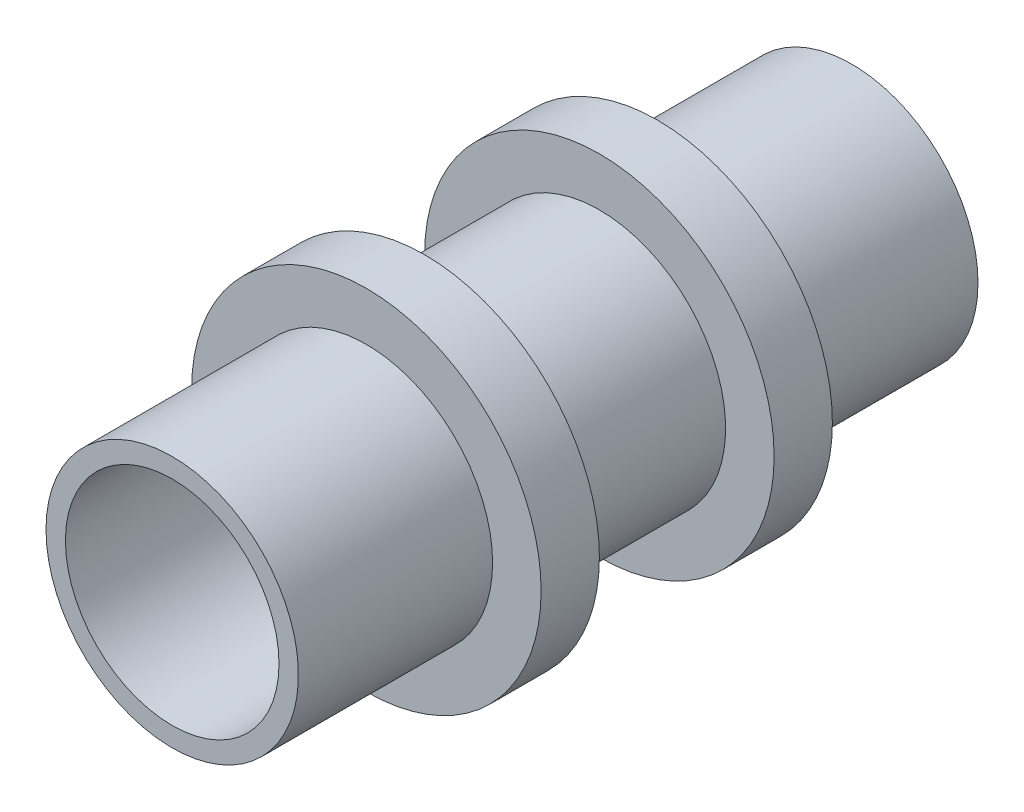
ISO-10303-21;
HEADER;
FILE_DESCRIPTION(('STEP AP214'),'2;1');
FILE_NAME('part.step','',(''),(''),'','','');
FILE_SCHEMA(('AUTOMOTIVE_DESIGN { 1 0 10303 214 1 1 1 1 }'));
ENDSEC;
DATA;
#1=APPLICATION_CONTEXT('core data for automotive mechanical design processes');
#2=APPLICATION_PROTOCOL_DEFINITION('international standard','automotive_design',2000,#1);
#3=PRODUCT_CONTEXT('',#1,'mechanical');
#4=PRODUCT('Part','Part','',(#3));
#5=PRODUCT_RELATED_PRODUCT_CATEGORY('part','',(#4));
#6=PRODUCT_DEFINITION_FORMATION('','',#4);
#7=PRODUCT_DEFINITION_CONTEXT('part definition',#1,'design');
#8=PRODUCT_DEFINITION('design','',#6,#7);
#9=PRODUCT_DEFINITION_SHAPE('','',#8);
#10=(LENGTH_UNIT() NAMED_UNIT(*) SI_UNIT(.MILLI.,.METRE.));
#11=(NAMED_UNIT(*) PLANE_ANGLE_UNIT() SI_UNIT($,.RADIAN.));
#12=(NAMED_UNIT(*) SI_UNIT($,.STERADIAN.) SOLID_ANGLE_UNIT());
#13=UNCERTAINTY_MEASURE_WITH_UNIT(LENGTH_MEASURE(1.E-05),#10,'distance_accuracy_value','');
#14=(GEOMETRIC_REPRESENTATION_CONTEXT(3) GLOBAL_UNCERTAINTY_ASSIGNED_CONTEXT((#13)) GLOBAL_UNIT_ASSIGNED_CONTEXT((#10,
#11,#12)) REPRESENTATION_CONTEXT('',''));
#15=CARTESIAN_POINT('',(0.,0.,0.));
#16=DIRECTION('',(0.,0.,1.));
#17=DIRECTION('',(1.,0.,0.));
#18=AXIS2_PLACEMENT_3D('',#15,#16,#17);
#19=CARTESIAN_POINT('',(0.,0.,0.));
#20=DIRECTION('',(0.,0.,1.));
#21=DIRECTION('',(1.,0.,0.));
#22=AXIS2_PLACEMENT_3D('',#19,#20,#21);
#23=PLANE('',#22);
#24=CARTESIAN_POINT('',(0.,0.,0.));
#25=DIRECTION('',(0.,0.,1.));
#26=DIRECTION('',(1.,0.,0.));
#27=AXIS2_PLACEMENT_3D('',#24,#25,#26);
#28=CIRCLE('',#27,11.43);
#29=CARTESIAN_POINT('',(-11.43,0.,0.));
#30=VERTEX_POINT('',#29);
#31=EDGE_CURVE('E57',#30,#30,#28,.T.);
#32=ORIENTED_EDGE('',*,*,#31,.F.);
#33=EDGE_LOOP('',(#32));
#34=FACE_BOUND('',#33,.T.);
#35=CARTESIAN_POINT('',(0.,0.,0.));
#36=DIRECTION('',(0.,0.,1.));
#37=DIRECTION('',(1.,0.,0.));
#38=AXIS2_PLACEMENT_3D('',#35,#36,#37);
#39=CIRCLE('',#38,8.255);
#40=CARTESIAN_POINT('',(8.255,0.,0.));
#41=VERTEX_POINT('',#40);
#42=EDGE_CURVE('E47',#41,#41,#39,.F.);
#43=ORIENTED_EDGE('',*,*,#42,.F.);
#44=EDGE_LOOP('',(#43));
#45=FACE_BOUND('',#44,.T.);
#46=ADVANCED_FACE('F39',(#34,#45),#23,.F.);
#47=CARTESIAN_POINT('',(0.,0.,19.05));
#48=DIRECTION('',(0.,0.,-1.));
#49=DIRECTION('',(-1.,0.,0.));
#50=AXIS2_PLACEMENT_3D('',#47,#48,#49);
#51=CYLINDRICAL_SURFACE('',#50,6.985);
#52=CARTESIAN_POINT('',(0.,0.,-12.7));
#53=DIRECTION('',(0.,0.,-1.));
#54=DIRECTION('',(-1.,0.,0.));
#55=AXIS2_PLACEMENT_3D('',#52,#53,#54);
#56=CIRCLE('',#55,6.985);
#57=CARTESIAN_POINT('',(-6.985,0.,-12.7));
#58=VERTEX_POINT('',#57);
#59=EDGE_CURVE('E71',#58,#58,#56,.T.);
#60=CARTESIAN_POINT('',(0.,0.,31.75));
#61=DIRECTION('',(0.,0.,-1.));
#62=DIRECTION('',(-1.,0.,0.));
#63=AXIS2_PLACEMENT_3D('',#60,#61,#62);
#64=CIRCLE('',#63,6.985);
#65=CARTESIAN_POINT('',(-6.985,0.,31.75));
#66=VERTEX_POINT('',#65);
#67=EDGE_CURVE('E91',#66,#66,#64,.T.);
#68=CARTESIAN_POINT('',(-6.985,0.,-12.7));
#69=CARTESIAN_POINT('',(-6.985,0.,-12.2369791666667));
#70=CARTESIAN_POINT('',(-6.985,0.,-11.7739583333333));
#71=CARTESIAN_POINT('',(-6.985,0.,-10.8479166666667));
#72=CARTESIAN_POINT('',(-6.985,0.,-10.3848958333333));
#73=CARTESIAN_POINT('',(-6.985,0.,-9.45885416666666));
#74=CARTESIAN_POINT('',(-6.985,0.,-8.99583333333333));
#75=CARTESIAN_POINT('',(-6.985,0.,-8.06979166666666));
#76=CARTESIAN_POINT('',(-6.985,0.,-7.60677083333333));
#77=CARTESIAN_POINT('',(-6.985,0.,-6.68072916666666));
#78=CARTESIAN_POINT('',(-6.985,0.,-6.21770833333333));
#79=CARTESIAN_POINT('',(-6.985,0.,-5.29166666666666));
#80=CARTESIAN_POINT('',(-6.985,0.,-4.82864583333333));
#81=CARTESIAN_POINT('',(-6.985,0.,-3.90260416666666));
#82=CARTESIAN_POINT('',(-6.985,0.,-3.43958333333333));
#83=CARTESIAN_POINT('',(-6.985,0.,-2.51354166666666));
#84=CARTESIAN_POINT('',(-6.985,0.,-2.05052083333333));
#85=CARTESIAN_POINT('',(-6.985,0.,-1.12447916666666));
#86=CARTESIAN_POINT('',(-6.985,0.,-0.661458333333329));
#87=CARTESIAN_POINT('',(-6.985,0.,0.264583333333338));
#88=CARTESIAN_POINT('',(-6.985,0.,0.727604166666671));
#89=CARTESIAN_POINT('',(-6.985,0.,1.65364583333334));
#90=CARTESIAN_POINT('',(-6.985,0.,2.11666666666667));
#91=CARTESIAN_POINT('',(-6.985,0.,3.04270833333334));
#92=CARTESIAN_POINT('',(-6.985,0.,3.50572916666667));
#93=CARTESIAN_POINT('',(-6.985,0.,4.43177083333334));
#94=CARTESIAN_POINT('',(-6.985,0.,4.89479166666667));
#95=CARTESIAN_POINT('',(-6.985,0.,5.82083333333334));
#96=CARTESIAN_POINT('',(-6.985,0.,6.28385416666667));
#97=CARTESIAN_POINT('',(-6.985,0.,7.20989583333334));
#98=CARTESIAN_POINT('',(-6.985,0.,7.67291666666667));
#99=CARTESIAN_POINT('',(-6.985,0.,8.59895833333334));
#100=CARTESIAN_POINT('',(-6.985,0.,9.06197916666667));
#101=CARTESIAN_POINT('',(-6.985,0.,9.98802083333334));
#102=CARTESIAN_POINT('',(-6.985,0.,10.4510416666667));
#103=CARTESIAN_POINT('',(-6.985,0.,11.3770833333333));
#104=CARTESIAN_POINT('',(-6.985,0.,11.8401041666667));
#105=CARTESIAN_POINT('',(-6.985,0.,12.7661458333333));
#106=CARTESIAN_POINT('',(-6.985,0.,13.2291666666667));
#107=CARTESIAN_POINT('',(-6.985,0.,14.1552083333333));
#108=CARTESIAN_POINT('',(-6.985,0.,14.6182291666667));
#109=CARTESIAN_POINT('',(-6.985,0.,15.5442708333333));
#110=CARTESIAN_POINT('',(-6.985,0.,16.0072916666667));
#111=CARTESIAN_POINT('',(-6.985,0.,16.9333333333333));
#112=CARTESIAN_POINT('',(-6.985,0.,17.3963541666667));
#113=CARTESIAN_POINT('',(-6.985,0.,18.3223958333333));
#114=CARTESIAN_POINT('',(-6.985,0.,18.7854166666667));
#115=CARTESIAN_POINT('',(-6.985,0.,19.7114583333333));
#116=CARTESIAN_POINT('',(-6.985,0.,20.1744791666667));
#117=CARTESIAN_POINT('',(-6.985,0.,21.1005208333333));
#118=CARTESIAN_POINT('',(-6.985,0.,21.5635416666667));
#119=CARTESIAN_POINT('',(-6.985,0.,22.4895833333333));
#120=CARTESIAN_POINT('',(-6.985,0.,22.9526041666667));
#121=CARTESIAN_POINT('',(-6.985,0.,23.8786458333333));
#122=CARTESIAN_POINT('',(-6.985,0.,24.3416666666667));
#123=CARTESIAN_POINT('',(-6.985,0.,25.2677083333333));
#124=CARTESIAN_POINT('',(-6.985,0.,25.7307291666667));
#125=CARTESIAN_POINT('',(-6.985,0.,26.6567708333333));
#126=CARTESIAN_POINT('',(-6.985,0.,27.1197916666667));
#127=CARTESIAN_POINT('',(-6.985,0.,28.0458333333333));
#128=CARTESIAN_POINT('',(-6.985,0.,28.5088541666667));
#129=CARTESIAN_POINT('',(-6.985,0.,29.4348958333333));
#130=CARTESIAN_POINT('',(-6.985,0.,29.8979166666667));
#131=CARTESIAN_POINT('',(-6.985,0.,30.8239583333333));
#132=CARTESIAN_POINT('',(-6.985,0.,31.2869791666667));
#133=CARTESIAN_POINT('',(-6.985,0.,31.75));
#134=B_SPLINE_CURVE_WITH_KNOTS('',3,(#68,#69,#70,#71,#72,#73,#74,#75,#76,#77,#78,#79,#80,#81,
#82,#83,#84,#85,#86,#87,#88,#89,#90,#91,#92,#93,#94,#95,#96,#97,#98,#99,#100,#101,#102,#103,
#104,#105,#106,#107,#108,#109,#110,#111,#112,#113,#114,#115,#116,#117,#118,#119,#120,#121,#122,
#123,#124,#125,#126,#127,#128,#129,#130,#131,#132,#133),.UNSPECIFIED.,.F.,.F.,(4,2,2,2,2,2,2,2,
2,2,2,2,2,2,2,2,2,2,2,2,2,2,2,2,2,2,2,2,2,2,2,2,4),(0.,1.3890625,2.778125,4.1671875,5.55625,
6.9453125,8.334375,9.7234375,11.1125,12.5015625,13.890625,15.2796875,16.66875,18.0578125,
19.446875,20.8359375,22.225,23.6140625,25.003125,26.3921875,27.78125,29.1703125,30.559375,
31.9484375,33.3375,34.7265625,36.115625,37.5046875,38.89375,40.2828125,41.671875,43.0609375,
44.45),.UNSPECIFIED.);
#135=EDGE_CURVE('BSEAM41',#58,#66,#134,.T.);
#136=ORIENTED_EDGE('',*,*,#59,.T.);
#137=ORIENTED_EDGE('',*,*,#67,.F.);
#138=ORIENTED_EDGE('',*,*,#135,.T.);
#139=ORIENTED_EDGE('',*,*,#135,.F.);
#140=EDGE_LOOP('',(#136,#138,#137,#139));
#141=FACE_BOUND('',#140,.T.);
#142=ADVANCED_FACE('F41',(#141),#51,.F.);
#143=CARTESIAN_POINT('',(0.,0.,19.05));
#144=DIRECTION('',(0.,0.,-1.));
#145=DIRECTION('',(-1.,0.,0.));
#146=AXIS2_PLACEMENT_3D('',#143,#144,#145);
#147=CYLINDRICAL_SURFACE('',#146,8.255);
#148=CARTESIAN_POINT('',(0.,0.,15.24));
#149=DIRECTION('',(0.,0.,1.));
#150=DIRECTION('',(1.,0.,0.));
#151=AXIS2_PLACEMENT_3D('',#148,#149,#150);
#152=CIRCLE('',#151,8.255);
#153=CARTESIAN_POINT('',(-8.255,0.,15.24));
#154=VERTEX_POINT('',#153);
#155=EDGE_CURVE('E80',#154,#154,#152,.T.);
#156=CARTESIAN_POINT('',(0.,0.,3.81));
#157=DIRECTION('',(0.,0.,1.));
#158=DIRECTION('',(1.,0.,0.));
#159=AXIS2_PLACEMENT_3D('',#156,#157,#158);
#160=CIRCLE('',#159,8.255);
#161=CARTESIAN_POINT('',(-8.255,0.,3.81));
#162=VERTEX_POINT('',#161);
#163=EDGE_CURVE('E62',#162,#162,#160,.T.);
#164=CARTESIAN_POINT('',(-8.255,0.,15.24));
#165=CARTESIAN_POINT('',(-8.255,0.,15.1209375));
#166=CARTESIAN_POINT('',(-8.255,0.,15.001875));
#167=CARTESIAN_POINT('',(-8.255,0.,14.76375));
#168=CARTESIAN_POINT('',(-8.255,0.,14.6446875));
#169=CARTESIAN_POINT('',(-8.255,0.,14.4065625));
#170=CARTESIAN_POINT('',(-8.255,0.,14.2875));
#171=CARTESIAN_POINT('',(-8.255,0.,14.049375));
#172=CARTESIAN_POINT('',(-8.255,0.,13.9303125));
#173=CARTESIAN_POINT('',(-8.255,0.,13.6921875));
#174=CARTESIAN_POINT('',(-8.255,0.,13.573125));
#175=CARTESIAN_POINT('',(-8.255,0.,13.335));
#176=CARTESIAN_POINT('',(-8.255,0.,13.2159375));
#177=CARTESIAN_POINT('',(-8.255,0.,12.9778125));
#178=CARTESIAN_POINT('',(-8.255,0.,12.85875));
#179=CARTESIAN_POINT('',(-8.255,0.,12.620625));
#180=CARTESIAN_POINT('',(-8.255,0.,12.5015625));
#181=CARTESIAN_POINT('',(-8.255,0.,12.2634375));
#182=CARTESIAN_POINT('',(-8.255,0.,12.144375));
#183=CARTESIAN_POINT('',(-8.255,0.,11.90625));
#184=CARTESIAN_POINT('',(-8.255,0.,11.7871875));
#185=CARTESIAN_POINT('',(-8.255,0.,11.5490625));
#186=CARTESIAN_POINT('',(-8.255,0.,11.43));
#187=CARTESIAN_POINT('',(-8.255,0.,11.191875));
#188=CARTESIAN_POINT('',(-8.255,0.,11.0728125));
#189=CARTESIAN_POINT('',(-8.255,0.,10.8346875));
#190=CARTESIAN_POINT('',(-8.255,0.,10.715625));
#191=CARTESIAN_POINT('',(-8.255,0.,10.4775));
#192=CARTESIAN_POINT('',(-8.255,0.,10.3584375));
#193=CARTESIAN_POINT('',(-8.255,0.,10.1203125));
#194=CARTESIAN_POINT('',(-8.255,0.,10.00125));
#195=CARTESIAN_POINT('',(-8.255,0.,9.763125));
#196=CARTESIAN_POINT('',(-8.255,0.,9.6440625));
#197=CARTESIAN_POINT('',(-8.255,0.,9.4059375));
#198=CARTESIAN_POINT('',(-8.255,0.,9.286875));
#199=CARTESIAN_POINT('',(-8.255,0.,9.04875));
#200=CARTESIAN_POINT('',(-8.255,0.,8.9296875));
#201=CARTESIAN_POINT('',(-8.255,0.,8.6915625));
#202=CARTESIAN_POINT('',(-8.255,0.,8.5725));
#203=CARTESIAN_POINT('',(-8.255,0.,8.334375));
#204=CARTESIAN_POINT('',(-8.255,0.,8.2153125));
#205=CARTESIAN_POINT('',(-8.255,0.,7.9771875));
#206=CARTESIAN_POINT('',(-8.255,0.,7.858125));
#207=CARTESIAN_POINT('',(-8.255,0.,7.62));
#208=CARTESIAN_POINT('',(-8.255,0.,7.5009375));
#209=CARTESIAN_POINT('',(-8.255,0.,7.2628125));
#210=CARTESIAN_POINT('',(-8.255,0.,7.14375));
#211=CARTESIAN_POINT('',(-8.255,0.,6.905625));
#212=CARTESIAN_POINT('',(-8.255,0.,6.7865625));
#213=CARTESIAN_POINT('',(-8.255,0.,6.5484375));
#214=CARTESIAN_POINT('',(-8.255,0.,6.429375));
#215=CARTESIAN_POINT('',(-8.255,0.,6.19125));
#216=CARTESIAN_POINT('',(-8.255,0.,6.0721875));
#217=CARTESIAN_POINT('',(-8.255,0.,5.8340625));
#218=CARTESIAN_POINT('',(-8.255,0.,5.715));
#219=CARTESIAN_POINT('',(-8.255,0.,5.476875));
#220=CARTESIAN_POINT('',(-8.255,0.,5.3578125));
#221=CARTESIAN_POINT('',(-8.255,0.,5.1196875));
#222=CARTESIAN_POINT('',(-8.255,0.,5.000625));
#223=CARTESIAN_POINT('',(-8.255,0.,4.7625));
#224=CARTESIAN_POINT('',(-8.255,0.,4.6434375));
#225=CARTESIAN_POINT('',(-8.255,0.,4.4053125));
#226=CARTESIAN_POINT('',(-8.255,0.,4.28625));
#227=CARTESIAN_POINT('',(-8.255,0.,4.048125));
#228=CARTESIAN_POINT('',(-8.255,0.,3.9290625));
#229=CARTESIAN_POINT('',(-8.255,0.,3.81));
#230=B_SPLINE_CURVE_WITH_KNOTS('',3,(#164,#165,#166,#167,#168,#169,#170,#171,#172,#173,#174,
#175,#176,#177,#178,#179,#180,#181,#182,#183,#184,#185,#186,#187,#188,#189,#190,#191,#192,#193,
#194,#195,#196,#197,#198,#199,#200,#201,#202,#203,#204,#205,#206,#207,#208,#209,#210,#211,#212,
#213,#214,#215,#216,#217,#218,#219,#220,#221,#222,#223,#224,#225,#226,#227,#228,#229),
.UNSPECIFIED.,.F.,.F.,(4,2,2,2,2,2,2,2,2,2,2,2,2,2,2,2,2,2,2,2,2,2,2,2,2,2,2,2,2,2,2,2,4),(0.,
0.3571875,0.714375000000001,1.0715625,1.42875,1.7859375,2.143125,2.5003125,2.8575,3.2146875,
3.571875,3.9290625,4.28625,4.6434375,5.000625,5.3578125,5.715,6.0721875,6.429375,6.7865625,
7.14375,7.5009375,7.858125,8.2153125,8.5725,8.9296875,9.286875,9.6440625,10.00125,10.3584375,
10.715625,11.0728125,11.43),.UNSPECIFIED.);
#231=EDGE_CURVE('BSEAM100',#154,#162,#230,.T.);
#232=ORIENTED_EDGE('',*,*,#155,.F.);
#233=ORIENTED_EDGE('',*,*,#163,.T.);
#234=ORIENTED_EDGE('',*,*,#231,.T.);
#235=ORIENTED_EDGE('',*,*,#231,.F.);
#236=EDGE_LOOP('',(#232,#234,#233,#235));
#237=FACE_BOUND('',#236,.T.);
#238=ADVANCED_FACE('F100',(#237),#147,.T.);
#239=CARTESIAN_POINT('',(0.,0.,19.05));
#240=DIRECTION('',(0.,0.,1.));
#241=DIRECTION('',(1.,0.,0.));
#242=AXIS2_PLACEMENT_3D('',#239,#240,#241);
#243=PLANE('',#242);
#244=CARTESIAN_POINT('',(0.,0.,19.05));
#245=DIRECTION('',(0.,0.,1.));
#246=DIRECTION('',(1.,0.,0.));
#247=AXIS2_PLACEMENT_3D('',#244,#245,#246);
#248=CIRCLE('',#247,8.255);
#249=CARTESIAN_POINT('',(8.255,0.,19.05));
#250=VERTEX_POINT('',#249);
#251=EDGE_CURVE('E10',#250,#250,#248,.T.);
#252=ORIENTED_EDGE('',*,*,#251,.F.);
#253=EDGE_LOOP('',(#252));
#254=FACE_BOUND('',#253,.T.);
#255=CARTESIAN_POINT('',(0.,0.,19.05));
#256=DIRECTION('',(0.,0.,1.));
#257=DIRECTION('',(1.,0.,0.));
#258=AXIS2_PLACEMENT_3D('',#255,#256,#257);
#259=CIRCLE('',#258,11.43);
#260=CARTESIAN_POINT('',(11.43,0.,19.05));
#261=VERTEX_POINT('',#260);
#262=EDGE_CURVE('E76',#261,#261,#259,.T.);
#263=ORIENTED_EDGE('',*,*,#262,.T.);
#264=EDGE_LOOP('',(#263));
#265=FACE_BOUND('',#264,.T.);
#266=ADVANCED_FACE('F106',(#254,#265),#243,.T.);
#267=CARTESIAN_POINT('',(0.,0.,3.81));
#268=DIRECTION('',(0.,0.,1.));
#269=DIRECTION('',(1.,0.,0.));
#270=AXIS2_PLACEMENT_3D('',#267,#268,#269);
#271=PLANE('',#270);
#272=CARTESIAN_POINT('',(0.,0.,3.81));
#273=DIRECTION('',(0.,0.,1.));
#274=DIRECTION('',(1.,0.,0.));
#275=AXIS2_PLACEMENT_3D('',#272,#273,#274);
#276=CIRCLE('',#275,11.43);
#277=CARTESIAN_POINT('',(-11.43,0.,3.81));
#278=VERTEX_POINT('',#277);
#279=EDGE_CURVE('E52',#278,#278,#276,.T.);
#280=ORIENTED_EDGE('',*,*,#279,.T.);
#281=EDGE_LOOP('',(#280));
#282=FACE_BOUND('',#281,.T.);
#283=ORIENTED_EDGE('',*,*,#163,.F.);
#284=EDGE_LOOP('',(#283));
#285=FACE_BOUND('',#284,.T.);
#286=ADVANCED_FACE('F125',(#282,#285),#271,.T.);
#287=CARTESIAN_POINT('',(0.,0.,3.81));
#288=DIRECTION('',(0.,0.,-1.));
#289=DIRECTION('',(-1.,0.,0.));
#290=AXIS2_PLACEMENT_3D('',#287,#288,#289);
#291=CYLINDRICAL_SURFACE('',#290,11.43);
#292=CARTESIAN_POINT('',(-11.43,0.,3.81));
#293=CARTESIAN_POINT('',(-11.43,0.,3.7703125));
#294=CARTESIAN_POINT('',(-11.43,0.,3.730625));
#295=CARTESIAN_POINT('',(-11.43,0.,3.65125));
#296=CARTESIAN_POINT('',(-11.43,0.,3.6115625));
#297=CARTESIAN_POINT('',(-11.43,0.,3.5321875));
#298=CARTESIAN_POINT('',(-11.43,0.,3.4925));
#299=CARTESIAN_POINT('',(-11.43,0.,3.413125));
#300=CARTESIAN_POINT('',(-11.43,0.,3.3734375));
#301=CARTESIAN_POINT('',(-11.43,0.,3.2940625));
#302=CARTESIAN_POINT('',(-11.43,0.,3.254375));
#303=CARTESIAN_POINT('',(-11.43,0.,3.175));
#304=CARTESIAN_POINT('',(-11.43,0.,3.1353125));
#305=CARTESIAN_POINT('',(-11.43,0.,3.0559375));
#306=CARTESIAN_POINT('',(-11.43,0.,3.01625));
#307=CARTESIAN_POINT('',(-11.43,0.,2.936875));
#308=CARTESIAN_POINT('',(-11.43,0.,2.8971875));
#309=CARTESIAN_POINT('',(-11.43,0.,2.8178125));
#310=CARTESIAN_POINT('',(-11.43,0.,2.778125));
#311=CARTESIAN_POINT('',(-11.43,0.,2.69875));
#312=CARTESIAN_POINT('',(-11.43,0.,2.6590625));
#313=CARTESIAN_POINT('',(-11.43,0.,2.5796875));
#314=CARTESIAN_POINT('',(-11.43,0.,2.54));
#315=CARTESIAN_POINT('',(-11.43,0.,2.460625));
#316=CARTESIAN_POINT('',(-11.43,0.,2.4209375));
#317=CARTESIAN_POINT('',(-11.43,0.,2.3415625));
#318=CARTESIAN_POINT('',(-11.43,0.,2.301875));
#319=CARTESIAN_POINT('',(-11.43,0.,2.2225));
#320=CARTESIAN_POINT('',(-11.43,0.,2.1828125));
#321=CARTESIAN_POINT('',(-11.43,0.,2.1034375));
#322=CARTESIAN_POINT('',(-11.43,0.,2.06375));
#323=CARTESIAN_POINT('',(-11.43,0.,1.984375));
#324=CARTESIAN_POINT('',(-11.43,0.,1.9446875));
#325=CARTESIAN_POINT('',(-11.43,0.,1.8653125));
#326=CARTESIAN_POINT('',(-11.43,0.,1.825625));
#327=CARTESIAN_POINT('',(-11.43,0.,1.74625));
#328=CARTESIAN_POINT('',(-11.43,0.,1.7065625));
#329=CARTESIAN_POINT('',(-11.43,0.,1.6271875));
#330=CARTESIAN_POINT('',(-11.43,0.,1.5875));
#331=CARTESIAN_POINT('',(-11.43,0.,1.508125));
#332=CARTESIAN_POINT('',(-11.43,0.,1.4684375));
#333=CARTESIAN_POINT('',(-11.43,0.,1.3890625));
#334=CARTESIAN_POINT('',(-11.43,0.,1.349375));
#335=CARTESIAN_POINT('',(-11.43,0.,1.27));
#336=CARTESIAN_POINT('',(-11.43,0.,1.2303125));
#337=CARTESIAN_POINT('',(-11.43,0.,1.1509375));
#338=CARTESIAN_POINT('',(-11.43,0.,1.11125));
#339=CARTESIAN_POINT('',(-11.43,0.,1.031875));
#340=CARTESIAN_POINT('',(-11.43,0.,0.9921875));
#341=CARTESIAN_POINT('',(-11.43,0.,0.9128125));
#342=CARTESIAN_POINT('',(-11.43,0.,0.873125));
#343=CARTESIAN_POINT('',(-11.43,0.,0.79375));
#344=CARTESIAN_POINT('',(-11.43,0.,0.7540625));
#345=CARTESIAN_POINT('',(-11.43,0.,0.6746875));
#346=CARTESIAN_POINT('',(-11.43,0.,0.635));
#347=CARTESIAN_POINT('',(-11.43,0.,0.555625));
#348=CARTESIAN_POINT('',(-11.43,0.,0.5159375));
#349=CARTESIAN_POINT('',(-11.43,0.,0.4365625));
#350=CARTESIAN_POINT('',(-11.43,0.,0.396875));
#351=CARTESIAN_POINT('',(-11.43,0.,0.3175));
#352=CARTESIAN_POINT('',(-11.43,0.,0.2778125));
#353=CARTESIAN_POINT('',(-11.43,0.,0.1984375));
#354=CARTESIAN_POINT('',(-11.43,0.,0.15875));
#355=CARTESIAN_POINT('',(-11.43,0.,0.0793749999999999));
#356=CARTESIAN_POINT('',(-11.43,0.,0.0396874999999999));
#357=CARTESIAN_POINT('',(-11.43,0.,0.));
#358=B_SPLINE_CURVE_WITH_KNOTS('',3,(#292,#293,#294,#295,#296,#297,#298,#299,#300,#301,#302,
#303,#304,#305,#306,#307,#308,#309,#310,#311,#312,#313,#314,#315,#316,#317,#318,#319,#320,#321,
#322,#323,#324,#325,#326,#327,#328,#329,#330,#331,#332,#333,#334,#335,#336,#337,#338,#339,#340,
#341,#342,#343,#344,#345,#346,#347,#348,#349,#350,#351,#352,#353,#354,#355,#356,#357),
.UNSPECIFIED.,.F.,.F.,(4,2,2,2,2,2,2,2,2,2,2,2,2,2,2,2,2,2,2,2,2,2,2,2,2,2,2,2,2,2,2,2,4),(0.,
0.1190625,0.238125,0.3571875,0.47625,0.595312499999999,0.714375,0.833437499999999,
0.952499999999999,1.0715625,1.190625,1.3096875,1.42875,1.5478125,1.666875,1.7859375,1.905,
2.0240625,2.143125,2.2621875,2.38125,2.5003125,2.619375,2.7384375,2.8575,2.9765625,3.095625,
3.2146875,3.33375,3.4528125,3.571875,3.6909375,3.81),.UNSPECIFIED.);
#359=EDGE_CURVE('BSEAM115',#278,#30,#358,.T.);
#360=ORIENTED_EDGE('',*,*,#279,.F.);
#361=ORIENTED_EDGE('',*,*,#31,.T.);
#362=ORIENTED_EDGE('',*,*,#359,.T.);
#363=ORIENTED_EDGE('',*,*,#359,.F.);
#364=EDGE_LOOP('',(#360,#362,#361,#363));
#365=FACE_BOUND('',#364,.T.);
#366=ADVANCED_FACE('F115',(#365),#291,.T.);
#367=CARTESIAN_POINT('',(0.,0.,-12.7));
#368=DIRECTION('',(0.,0.,-1.));
#369=DIRECTION('',(-1.,0.,0.));
#370=AXIS2_PLACEMENT_3D('',#367,#368,#369);
#371=PLANE('',#370);
#372=CARTESIAN_POINT('',(0.,0.,-12.7));
#373=DIRECTION('',(0.,0.,-1.));
#374=DIRECTION('',(-1.,0.,0.));
#375=AXIS2_PLACEMENT_3D('',#372,#373,#374);
#376=CIRCLE('',#375,8.255);
#377=CARTESIAN_POINT('',(-8.255,0.,-12.7));
#378=VERTEX_POINT('',#377);
#379=EDGE_CURVE('E67',#378,#378,#376,.T.);
#380=ORIENTED_EDGE('',*,*,#379,.T.);
#381=EDGE_LOOP('',(#380));
#382=FACE_BOUND('',#381,.T.);
#383=ORIENTED_EDGE('',*,*,#59,.F.);
#384=EDGE_LOOP('',(#383));
#385=FACE_BOUND('',#384,.T.);
#386=ADVANCED_FACE('F112',(#382,#385),#371,.T.);
#387=CARTESIAN_POINT('',(0.,0.,-12.7));
#388=DIRECTION('',(0.,0.,1.));
#389=DIRECTION('',(1.,0.,0.));
#390=AXIS2_PLACEMENT_3D('',#387,#388,#389);
#391=CYLINDRICAL_SURFACE('',#390,8.255);
#392=ORIENTED_EDGE('',*,*,#379,.F.);
#393=EDGE_LOOP('',(#392));
#394=FACE_BOUND('',#393,.T.);
#395=ORIENTED_EDGE('',*,*,#42,.T.);
#396=EDGE_LOOP('',(#395));
#397=FACE_BOUND('',#396,.T.);
#398=ADVANCED_FACE('F114',(#394,#397),#391,.T.);
#399=CARTESIAN_POINT('',(0.,0.,15.24));
#400=DIRECTION('',(0.,0.,1.));
#401=DIRECTION('',(1.,0.,0.));
#402=AXIS2_PLACEMENT_3D('',#399,#400,#401);
#403=CYLINDRICAL_SURFACE('',#402,11.43);
#404=CARTESIAN_POINT('',(0.,0.,15.24));
#405=DIRECTION('',(0.,0.,1.));
#406=DIRECTION('',(1.,0.,0.));
#407=AXIS2_PLACEMENT_3D('',#404,#405,#406);
#408=CIRCLE('',#407,11.43);
#409=CARTESIAN_POINT('',(11.43,0.,15.24));
#410=VERTEX_POINT('',#409);
#411=EDGE_CURVE('E75',#410,#410,#408,.T.);
#412=CARTESIAN_POINT('',(11.43,0.,15.24));
#413=CARTESIAN_POINT('',(11.43,0.,15.2796875));
#414=CARTESIAN_POINT('',(11.43,0.,15.319375));
#415=CARTESIAN_POINT('',(11.43,0.,15.39875));
#416=CARTESIAN_POINT('',(11.43,0.,15.4384375));
#417=CARTESIAN_POINT('',(11.43,0.,15.5178125));
#418=CARTESIAN_POINT('',(11.43,0.,15.5575));
#419=CARTESIAN_POINT('',(11.43,0.,15.636875));
#420=CARTESIAN_POINT('',(11.43,0.,15.6765625));
#421=CARTESIAN_POINT('',(11.43,0.,15.7559375));
#422=CARTESIAN_POINT('',(11.43,0.,15.795625));
#423=CARTESIAN_POINT('',(11.43,0.,15.875));
#424=CARTESIAN_POINT('',(11.43,0.,15.9146875));
#425=CARTESIAN_POINT('',(11.43,0.,15.9940625));
#426=CARTESIAN_POINT('',(11.43,0.,16.03375));
#427=CARTESIAN_POINT('',(11.43,0.,16.113125));
#428=CARTESIAN_POINT('',(11.43,0.,16.1528125));
#429=CARTESIAN_POINT('',(11.43,0.,16.2321875));
#430=CARTESIAN_POINT('',(11.43,0.,16.271875));
#431=CARTESIAN_POINT('',(11.43,0.,16.35125));
#432=CARTESIAN_POINT('',(11.43,0.,16.3909375));
#433=CARTESIAN_POINT('',(11.43,0.,16.4703125));
#434=CARTESIAN_POINT('',(11.43,0.,16.51));
#435=CARTESIAN_POINT('',(11.43,0.,16.589375));
#436=CARTESIAN_POINT('',(11.43,0.,16.6290625));
#437=CARTESIAN_POINT('',(11.43,0.,16.7084375));
#438=CARTESIAN_POINT('',(11.43,0.,16.748125));
#439=CARTESIAN_POINT('',(11.43,0.,16.8275));
#440=CARTESIAN_POINT('',(11.43,0.,16.8671875));
#441=CARTESIAN_POINT('',(11.43,0.,16.9465625));
#442=CARTESIAN_POINT('',(11.43,0.,16.98625));
#443=CARTESIAN_POINT('',(11.43,0.,17.065625));
#444=CARTESIAN_POINT('',(11.43,0.,17.1053125));
#445=CARTESIAN_POINT('',(11.43,0.,17.1846875));
#446=CARTESIAN_POINT('',(11.43,0.,17.224375));
#447=CARTESIAN_POINT('',(11.43,0.,17.30375));
#448=CARTESIAN_POINT('',(11.43,0.,17.3434375));
#449=CARTESIAN_POINT('',(11.43,0.,17.4228125));
#450=CARTESIAN_POINT('',(11.43,0.,17.4625));
#451=CARTESIAN_POINT('',(11.43,0.,17.541875));
#452=CARTESIAN_POINT('',(11.43,0.,17.5815625));
#453=CARTESIAN_POINT('',(11.43,0.,17.6609375));
#454=CARTESIAN_POINT('',(11.43,0.,17.700625));
#455=CARTESIAN_POINT('',(11.43,0.,17.78));
#456=CARTESIAN_POINT('',(11.43,0.,17.8196875));
#457=CARTESIAN_POINT('',(11.43,0.,17.8990625));
#458=CARTESIAN_POINT('',(11.43,0.,17.93875));
#459=CARTESIAN_POINT('',(11.43,0.,18.018125));
#460=CARTESIAN_POINT('',(11.43,0.,18.0578125));
#461=CARTESIAN_POINT('',(11.43,0.,18.1371875));
#462=CARTESIAN_POINT('',(11.43,0.,18.176875));
#463=CARTESIAN_POINT('',(11.43,0.,18.25625));
#464=CARTESIAN_POINT('',(11.43,0.,18.2959375));
#465=CARTESIAN_POINT('',(11.43,0.,18.3753125));
#466=CARTESIAN_POINT('',(11.43,0.,18.415));
#467=CARTESIAN_POINT('',(11.43,0.,18.494375));
#468=CARTESIAN_POINT('',(11.43,0.,18.5340625));
#469=CARTESIAN_POINT('',(11.43,0.,18.6134375));
#470=CARTESIAN_POINT('',(11.43,0.,18.653125));
#471=CARTESIAN_POINT('',(11.43,0.,18.7325));
#472=CARTESIAN_POINT('',(11.43,0.,18.7721875));
#473=CARTESIAN_POINT('',(11.43,0.,18.8515625));
#474=CARTESIAN_POINT('',(11.43,0.,18.89125));
#475=CARTESIAN_POINT('',(11.43,0.,18.970625));
#476=CARTESIAN_POINT('',(11.43,0.,19.0103125));
#477=CARTESIAN_POINT('',(11.43,0.,19.05));
#478=B_SPLINE_CURVE_WITH_KNOTS('',3,(#412,#413,#414,#415,#416,#417,#418,#419,#420,#421,#422,
#423,#424,#425,#426,#427,#428,#429,#430,#431,#432,#433,#434,#435,#436,#437,#438,#439,#440,#441,
#442,#443,#444,#445,#446,#447,#448,#449,#450,#451,#452,#453,#454,#455,#456,#457,#458,#459,#460,
#461,#462,#463,#464,#465,#466,#467,#468,#469,#470,#471,#472,#473,#474,#475,#476,#477),
.UNSPECIFIED.,.F.,.F.,(4,2,2,2,2,2,2,2,2,2,2,2,2,2,2,2,2,2,2,2,2,2,2,2,2,2,2,2,2,2,2,2,4),(0.,
0.119062500000001,0.238125,0.357187500000002,0.476250000000001,0.5953125,0.714375,
0.833437499999999,0.952500000000002,1.0715625,1.190625,1.3096875,1.42875,1.5478125,1.666875,
1.7859375,1.905,2.0240625,2.143125,2.2621875,2.38125,2.5003125,2.619375,2.7384375,2.8575,
2.9765625,3.095625,3.2146875,3.33375,3.4528125,3.571875,3.6909375,3.81),.UNSPECIFIED.);
#479=EDGE_CURVE('BSEAM122',#410,#261,#478,.T.);
#480=ORIENTED_EDGE('',*,*,#411,.T.);
#481=ORIENTED_EDGE('',*,*,#262,.F.);
#482=ORIENTED_EDGE('',*,*,#479,.T.);
#483=ORIENTED_EDGE('',*,*,#479,.F.);
#484=EDGE_LOOP('',(#480,#482,#481,#483));
#485=FACE_BOUND('',#484,.T.);
#486=ADVANCED_FACE('F122',(#485),#403,.T.);
#487=CARTESIAN_POINT('',(0.,0.,15.24));
#488=DIRECTION('',(0.,0.,-1.));
#489=DIRECTION('',(1.,0.,0.));
#490=AXIS2_PLACEMENT_3D('',#487,#488,#489);
#491=PLANE('',#490);
#492=ORIENTED_EDGE('',*,*,#155,.T.);
#493=EDGE_LOOP('',(#492));
#494=FACE_BOUND('',#493,.T.);
#495=ORIENTED_EDGE('',*,*,#411,.F.);
#496=EDGE_LOOP('',(#495));
#497=FACE_BOUND('',#496,.T.);
#498=ADVANCED_FACE('F142',(#494,#497),#491,.T.);
#499=CARTESIAN_POINT('',(0.,0.,31.75));
#500=DIRECTION('',(0.,0.,-1.));
#501=DIRECTION('',(-1.,0.,0.));
#502=AXIS2_PLACEMENT_3D('',#499,#500,#501);
#503=CYLINDRICAL_SURFACE('',#502,8.255);
#504=CARTESIAN_POINT('',(0.,0.,31.75));
#505=DIRECTION('',(0.,0.,-1.));
#506=DIRECTION('',(-1.,0.,0.));
#507=AXIS2_PLACEMENT_3D('',#504,#505,#506);
#508=CIRCLE('',#507,8.255);
#509=CARTESIAN_POINT('',(-8.255,0.,31.75));
#510=VERTEX_POINT('',#509);
#511=EDGE_CURVE('E87',#510,#510,#508,.T.);
#512=ORIENTED_EDGE('',*,*,#511,.T.);
#513=EDGE_LOOP('',(#512));
#514=FACE_BOUND('',#513,.T.);
#515=ORIENTED_EDGE('',*,*,#251,.T.);
#516=EDGE_LOOP('',(#515));
#517=FACE_BOUND('',#516,.T.);
#518=ADVANCED_FACE('F147',(#514,#517),#503,.T.);
#519=CARTESIAN_POINT('',(0.,0.,31.75));
#520=DIRECTION('',(0.,0.,1.));
#521=DIRECTION('',(-1.,0.,0.));
#522=AXIS2_PLACEMENT_3D('',#519,#520,#521);
#523=PLANE('',#522);
#524=ORIENTED_EDGE('',*,*,#67,.T.);
#525=EDGE_LOOP('',(#524));
#526=FACE_BOUND('',#525,.T.);
#527=ORIENTED_EDGE('',*,*,#511,.F.);
#528=EDGE_LOOP('',(#527));
#529=FACE_BOUND('',#528,.T.);
#530=ADVANCED_FACE('F96',(#526,#529),#523,.T.);
#531=CLOSED_SHELL('',(#46,#142,#238,#266,#286,#366,#386,#398,#486,#498,#518,#530));
#532=MANIFOLD_SOLID_BREP('B2',#531);
#533=ADVANCED_BREP_SHAPE_REPRESENTATION('',(#18,#532),#14);
#534=SHAPE_DEFINITION_REPRESENTATION(#9,#533);
ENDSEC;
END-ISO-10303-21;
